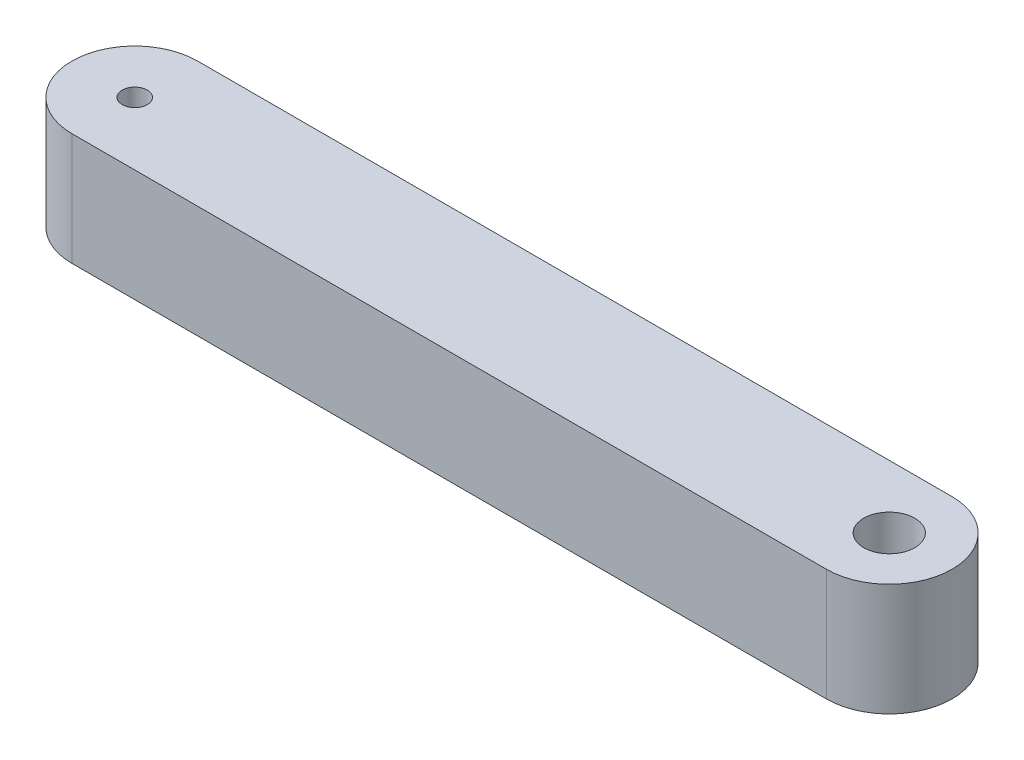
ISO-10303-21;
HEADER;
FILE_DESCRIPTION(('STEP AP214'),'2;1');
FILE_NAME('part.step','',(''),(''),'','','');
FILE_SCHEMA(('AUTOMOTIVE_DESIGN { 1 0 10303 214 1 1 1 1 }'));
ENDSEC;
DATA;
#1=APPLICATION_CONTEXT('core data for automotive mechanical design processes');
#2=APPLICATION_PROTOCOL_DEFINITION('international standard','automotive_design',2000,#1);
#3=PRODUCT_CONTEXT('',#1,'mechanical');
#4=PRODUCT('Part','Part','',(#3));
#5=PRODUCT_RELATED_PRODUCT_CATEGORY('part','',(#4));
#6=PRODUCT_DEFINITION_FORMATION('','',#4);
#7=PRODUCT_DEFINITION_CONTEXT('part definition',#1,'design');
#8=PRODUCT_DEFINITION('design','',#6,#7);
#9=PRODUCT_DEFINITION_SHAPE('','',#8);
#10=(LENGTH_UNIT() NAMED_UNIT(*) SI_UNIT(.MILLI.,.METRE.));
#11=(NAMED_UNIT(*) PLANE_ANGLE_UNIT() SI_UNIT($,.RADIAN.));
#12=(NAMED_UNIT(*) SI_UNIT($,.STERADIAN.) SOLID_ANGLE_UNIT());
#13=UNCERTAINTY_MEASURE_WITH_UNIT(LENGTH_MEASURE(1.E-05),#10,'distance_accuracy_value','');
#14=(GEOMETRIC_REPRESENTATION_CONTEXT(3) GLOBAL_UNCERTAINTY_ASSIGNED_CONTEXT((#13)) GLOBAL_UNIT_ASSIGNED_CONTEXT((#10,
#11,#12)) REPRESENTATION_CONTEXT('',''));
#15=CARTESIAN_POINT('',(0.,0.,0.));
#16=DIRECTION('',(0.,0.,1.));
#17=DIRECTION('',(1.,0.,0.));
#18=AXIS2_PLACEMENT_3D('',#15,#16,#17);
#19=CARTESIAN_POINT('',(90.,26.8,0.));
#20=DIRECTION('',(0.,-1.,0.));
#21=DIRECTION('',(0.,0.,-1.));
#22=AXIS2_PLACEMENT_3D('',#19,#20,#21);
#23=CYLINDRICAL_SURFACE('',#22,6.1);
#24=CARTESIAN_POINT('',(90.,26.8,0.));
#25=DIRECTION('',(0.,-1.,0.));
#26=DIRECTION('',(0.,0.,-1.));
#27=AXIS2_PLACEMENT_3D('',#24,#25,#26);
#28=CIRCLE('',#27,6.1);
#29=CARTESIAN_POINT('',(90.,26.8,-6.1));
#30=VERTEX_POINT('',#29);
#31=EDGE_CURVE('E121',#30,#30,#28,.T.);
#32=ORIENTED_EDGE('',*,*,#31,.F.);
#33=EDGE_LOOP('',(#32));
#34=FACE_BOUND('',#33,.T.);
#35=CARTESIAN_POINT('',(90.,5.,0.));
#36=DIRECTION('',(0.,-1.,0.));
#37=DIRECTION('',(0.,0.,-1.));
#38=AXIS2_PLACEMENT_3D('',#35,#36,#37);
#39=CIRCLE('',#38,6.1);
#40=CARTESIAN_POINT('',(90.,5.,-6.1));
#41=VERTEX_POINT('',#40);
#42=EDGE_CURVE('E41',#41,#41,#39,.F.);
#43=ORIENTED_EDGE('',*,*,#42,.F.);
#44=EDGE_LOOP('',(#43));
#45=FACE_BOUND('',#44,.T.);
#46=ADVANCED_FACE('F37',(#34,#45),#23,.F.);
#47=CARTESIAN_POINT('',(90.,26.8,0.));
#48=DIRECTION('',(0.,1.,0.));
#49=DIRECTION('',(0.,0.,1.));
#50=AXIS2_PLACEMENT_3D('',#47,#48,#49);
#51=PLANE('',#50);
#52=ORIENTED_EDGE('',*,*,#31,.T.);
#53=EDGE_LOOP('',(#52));
#54=FACE_BOUND('',#53,.T.);
#55=CARTESIAN_POINT('',(-90.,26.8,0.));
#56=DIRECTION('',(0.,1.,0.));
#57=DIRECTION('',(0.,0.,1.));
#58=AXIS2_PLACEMENT_3D('',#55,#56,#57);
#59=CIRCLE('',#58,3.00000000000001);
#60=CARTESIAN_POINT('',(-90.,26.8,3.00000000000001));
#61=VERTEX_POINT('',#60);
#62=EDGE_CURVE('E106',#61,#61,#59,.T.);
#63=ORIENTED_EDGE('',*,*,#62,.F.);
#64=EDGE_LOOP('',(#63));
#65=FACE_BOUND('',#64,.T.);
#66=CARTESIAN_POINT('',(90.,26.8,0.));
#67=DIRECTION('',(0.,1.,0.));
#68=DIRECTION('',(0.,0.,1.));
#69=AXIS2_PLACEMENT_3D('',#66,#67,#68);
#70=CIRCLE('',#69,15.);
#71=CARTESIAN_POINT('',(90.,26.8,15.));
#72=VERTEX_POINT('',#71);
#73=CARTESIAN_POINT('',(90.,26.8,-15.));
#74=VERTEX_POINT('',#73);
#75=EDGE_CURVE('E90',#72,#74,#70,.T.);
#76=ORIENTED_EDGE('',*,*,#75,.T.);
#77=DIRECTION('',(-1.,0.,0.));
#78=VECTOR('',#77,1.);
#79=CARTESIAN_POINT('',(-90.,26.8,-15.));
#80=LINE('',#79,#78);
#81=CARTESIAN_POINT('',(-90.,26.8,-15.));
#82=VERTEX_POINT('',#81);
#83=EDGE_CURVE('E85',#74,#82,#80,.T.);
#84=ORIENTED_EDGE('',*,*,#83,.T.);
#85=CARTESIAN_POINT('',(-90.,26.8,0.));
#86=DIRECTION('',(0.,1.,0.));
#87=DIRECTION('',(0.,0.,-1.));
#88=AXIS2_PLACEMENT_3D('',#85,#86,#87);
#89=CIRCLE('',#88,15.);
#90=CARTESIAN_POINT('',(-90.,26.8,15.));
#91=VERTEX_POINT('',#90);
#92=EDGE_CURVE('E88',#82,#91,#89,.T.);
#93=ORIENTED_EDGE('',*,*,#92,.T.);
#94=DIRECTION('',(1.,0.,0.));
#95=VECTOR('',#94,1.);
#96=CARTESIAN_POINT('',(-90.,26.8,15.));
#97=LINE('',#96,#95);
#98=EDGE_CURVE('E55',#91,#72,#97,.T.);
#99=ORIENTED_EDGE('',*,*,#98,.T.);
#100=EDGE_LOOP('',(#76,#84,#93,#99));
#101=FACE_BOUND('',#100,.T.);
#102=ADVANCED_FACE('F86',(#54,#65,#101),#51,.T.);
#103=CARTESIAN_POINT('',(90.,0.,0.));
#104=DIRECTION('',(0.,1.,0.));
#105=DIRECTION('',(0.,0.,1.));
#106=AXIS2_PLACEMENT_3D('',#103,#104,#105);
#107=PLANE('',#106);
#108=CARTESIAN_POINT('',(90.,0.,0.));
#109=DIRECTION('',(0.,-1.,0.));
#110=DIRECTION('',(0.,0.,-1.));
#111=AXIS2_PLACEMENT_3D('',#108,#109,#110);
#112=CIRCLE('',#111,6.5);
#113=CARTESIAN_POINT('',(90.,0.,-6.50000000000003));
#114=VERTEX_POINT('',#113);
#115=EDGE_CURVE('E126',#114,#114,#112,.T.);
#116=ORIENTED_EDGE('',*,*,#115,.F.);
#117=EDGE_LOOP('',(#116));
#118=FACE_BOUND('',#117,.T.);
#119=CARTESIAN_POINT('',(90.,0.,0.));
#120=DIRECTION('',(0.,1.,0.));
#121=DIRECTION('',(0.,0.,1.));
#122=AXIS2_PLACEMENT_3D('',#119,#120,#121);
#123=CIRCLE('',#122,15.);
#124=CARTESIAN_POINT('',(90.,0.,15.));
#125=VERTEX_POINT('',#124);
#126=CARTESIAN_POINT('',(90.,0.,-15.));
#127=VERTEX_POINT('',#126);
#128=EDGE_CURVE('E103',#125,#127,#123,.T.);
#129=ORIENTED_EDGE('',*,*,#128,.F.);
#130=DIRECTION('',(1.,0.,0.));
#131=VECTOR('',#130,1.);
#132=CARTESIAN_POINT('',(-90.,0.,15.));
#133=LINE('',#132,#131);
#134=CARTESIAN_POINT('',(-90.,0.,15.));
#135=VERTEX_POINT('',#134);
#136=EDGE_CURVE('E78',#135,#125,#133,.T.);
#137=ORIENTED_EDGE('',*,*,#136,.F.);
#138=CARTESIAN_POINT('',(-90.,0.,0.));
#139=DIRECTION('',(0.,1.,0.));
#140=DIRECTION('',(0.,0.,-1.));
#141=AXIS2_PLACEMENT_3D('',#138,#139,#140);
#142=CIRCLE('',#141,15.);
#143=CARTESIAN_POINT('',(-90.,0.,-15.));
#144=VERTEX_POINT('',#143);
#145=EDGE_CURVE('E72',#144,#135,#142,.T.);
#146=ORIENTED_EDGE('',*,*,#145,.F.);
#147=DIRECTION('',(-1.,0.,0.));
#148=VECTOR('',#147,1.);
#149=CARTESIAN_POINT('',(-90.,0.,-15.));
#150=LINE('',#149,#148);
#151=EDGE_CURVE('E94',#127,#144,#150,.T.);
#152=ORIENTED_EDGE('',*,*,#151,.F.);
#153=EDGE_LOOP('',(#129,#137,#146,#152));
#154=FACE_BOUND('',#153,.T.);
#155=CARTESIAN_POINT('',(-90.,0.,0.));
#156=DIRECTION('',(0.,1.,0.));
#157=DIRECTION('',(0.,0.,1.));
#158=AXIS2_PLACEMENT_3D('',#155,#156,#157);
#159=CIRCLE('',#158,3.00000000000001);
#160=CARTESIAN_POINT('',(-90.,0.,3.00000000000001));
#161=VERTEX_POINT('',#160);
#162=EDGE_CURVE('E118',#161,#161,#159,.T.);
#163=ORIENTED_EDGE('',*,*,#162,.T.);
#164=EDGE_LOOP('',(#163));
#165=FACE_BOUND('',#164,.T.);
#166=ADVANCED_FACE('F114',(#118,#154,#165),#107,.F.);
#167=CARTESIAN_POINT('',(90.,26.8,0.));
#168=DIRECTION('',(0.,-1.,0.));
#169=DIRECTION('',(0.,0.,-1.));
#170=AXIS2_PLACEMENT_3D('',#167,#168,#169);
#171=CYLINDRICAL_SURFACE('',#170,15.);
#172=ORIENTED_EDGE('',*,*,#128,.T.);
#173=DIRECTION('',(0.,-1.,0.));
#174=VECTOR('',#173,1.);
#175=CARTESIAN_POINT('',(90.,26.8,-15.));
#176=LINE('',#175,#174);
#177=EDGE_CURVE('E11',#74,#127,#176,.T.);
#178=ORIENTED_EDGE('',*,*,#177,.F.);
#179=ORIENTED_EDGE('',*,*,#75,.F.);
#180=DIRECTION('',(0.,-1.,0.));
#181=VECTOR('',#180,1.);
#182=CARTESIAN_POINT('',(90.,26.8,15.));
#183=LINE('',#182,#181);
#184=EDGE_CURVE('E99',#72,#125,#183,.T.);
#185=ORIENTED_EDGE('',*,*,#184,.T.);
#186=EDGE_LOOP('',(#172,#178,#179,#185));
#187=FACE_BOUND('',#186,.T.);
#188=ADVANCED_FACE('F39',(#187),#171,.T.);
#189=CARTESIAN_POINT('',(-90.,26.8,-15.));
#190=DIRECTION('',(0.,0.,1.));
#191=DIRECTION('',(1.,0.,0.));
#192=AXIS2_PLACEMENT_3D('',#189,#190,#191);
#193=PLANE('',#192);
#194=ORIENTED_EDGE('',*,*,#151,.T.);
#195=DIRECTION('',(0.,-1.,0.));
#196=VECTOR('',#195,1.);
#197=CARTESIAN_POINT('',(-90.,26.8,-15.));
#198=LINE('',#197,#196);
#199=EDGE_CURVE('E47',#82,#144,#198,.T.);
#200=ORIENTED_EDGE('',*,*,#199,.F.);
#201=ORIENTED_EDGE('',*,*,#83,.F.);
#202=ORIENTED_EDGE('',*,*,#177,.T.);
#203=EDGE_LOOP('',(#194,#200,#201,#202));
#204=FACE_BOUND('',#203,.T.);
#205=ADVANCED_FACE('F93',(#204),#193,.F.);
#206=CARTESIAN_POINT('',(-90.,26.8,0.));
#207=DIRECTION('',(0.,-1.,0.));
#208=DIRECTION('',(0.,0.,-1.));
#209=AXIS2_PLACEMENT_3D('',#206,#207,#208);
#210=CYLINDRICAL_SURFACE('',#209,15.);
#211=ORIENTED_EDGE('',*,*,#145,.T.);
#212=DIRECTION('',(0.,-1.,0.));
#213=VECTOR('',#212,1.);
#214=CARTESIAN_POINT('',(-90.,26.8,15.));
#215=LINE('',#214,#213);
#216=EDGE_CURVE('E95',#91,#135,#215,.T.);
#217=ORIENTED_EDGE('',*,*,#216,.F.);
#218=ORIENTED_EDGE('',*,*,#92,.F.);
#219=ORIENTED_EDGE('',*,*,#199,.T.);
#220=EDGE_LOOP('',(#211,#217,#218,#219));
#221=FACE_BOUND('',#220,.T.);
#222=ADVANCED_FACE('F97',(#221),#210,.T.);
#223=CARTESIAN_POINT('',(-90.,26.8,15.));
#224=DIRECTION('',(0.,0.,-1.));
#225=DIRECTION('',(-1.,0.,0.));
#226=AXIS2_PLACEMENT_3D('',#223,#224,#225);
#227=PLANE('',#226);
#228=ORIENTED_EDGE('',*,*,#136,.T.);
#229=ORIENTED_EDGE('',*,*,#184,.F.);
#230=ORIENTED_EDGE('',*,*,#98,.F.);
#231=ORIENTED_EDGE('',*,*,#216,.T.);
#232=EDGE_LOOP('',(#228,#229,#230,#231));
#233=FACE_BOUND('',#232,.T.);
#234=ADVANCED_FACE('F111',(#233),#227,.F.);
#235=CARTESIAN_POINT('',(-90.,26.8,0.));
#236=DIRECTION('',(0.,-1.,0.));
#237=DIRECTION('',(0.,0.,-1.));
#238=AXIS2_PLACEMENT_3D('',#235,#236,#237);
#239=CYLINDRICAL_SURFACE('',#238,3.00000000000001);
#240=ORIENTED_EDGE('',*,*,#62,.T.);
#241=EDGE_LOOP('',(#240));
#242=FACE_BOUND('',#241,.T.);
#243=ORIENTED_EDGE('',*,*,#162,.F.);
#244=EDGE_LOOP('',(#243));
#245=FACE_BOUND('',#244,.T.);
#246=ADVANCED_FACE('F151',(#242,#245),#239,.F.);
#247=CARTESIAN_POINT('',(90.,5.,0.));
#248=DIRECTION('',(0.,-1.,0.));
#249=DIRECTION('',(0.,0.,-1.));
#250=AXIS2_PLACEMENT_3D('',#247,#248,#249);
#251=PLANE('',#250);
#252=CARTESIAN_POINT('',(90.,5.,0.));
#253=DIRECTION('',(0.,-1.,0.));
#254=DIRECTION('',(0.,0.,-1.));
#255=AXIS2_PLACEMENT_3D('',#252,#253,#254);
#256=CIRCLE('',#255,6.5);
#257=CARTESIAN_POINT('',(90.,5.,-6.50000000000003));
#258=VERTEX_POINT('',#257);
#259=EDGE_CURVE('E129',#258,#258,#256,.T.);
#260=ORIENTED_EDGE('',*,*,#259,.T.);
#261=EDGE_LOOP('',(#260));
#262=FACE_BOUND('',#261,.T.);
#263=ORIENTED_EDGE('',*,*,#42,.T.);
#264=EDGE_LOOP('',(#263));
#265=FACE_BOUND('',#264,.T.);
#266=ADVANCED_FACE('F136',(#262,#265),#251,.T.);
#267=CARTESIAN_POINT('',(90.,5.,0.));
#268=DIRECTION('',(0.,-1.,0.));
#269=DIRECTION('',(0.,0.,-1.));
#270=AXIS2_PLACEMENT_3D('',#267,#268,#269);
#271=CYLINDRICAL_SURFACE('',#270,6.5);
#272=ORIENTED_EDGE('',*,*,#259,.F.);
#273=EDGE_LOOP('',(#272));
#274=FACE_BOUND('',#273,.T.);
#275=ORIENTED_EDGE('',*,*,#115,.T.);
#276=EDGE_LOOP('',(#275));
#277=FACE_BOUND('',#276,.T.);
#278=ADVANCED_FACE('F149',(#274,#277),#271,.F.);
#279=CLOSED_SHELL('',(#46,#102,#166,#188,#205,#222,#234,#246,#266,#278));
#280=MANIFOLD_SOLID_BREP('B2',#279);
#281=ADVANCED_BREP_SHAPE_REPRESENTATION('',(#18,#280),#14);
#282=SHAPE_DEFINITION_REPRESENTATION(#9,#281);
ENDSEC;
END-ISO-10303-21;
